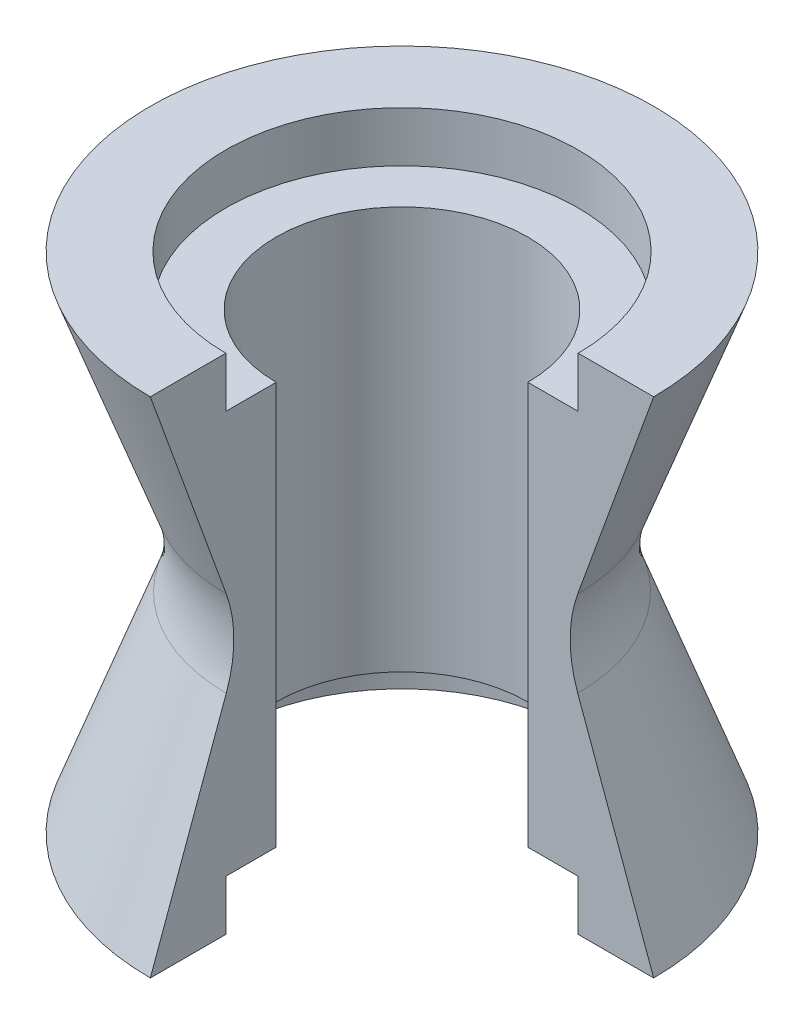
ISO-10303-21;
HEADER;
FILE_DESCRIPTION(('STEP AP214'),'2;1');
FILE_NAME('part.step','',(''),(''),'','','');
FILE_SCHEMA(('AUTOMOTIVE_DESIGN { 1 0 10303 214 1 1 1 1 }'));
ENDSEC;
DATA;
#1=APPLICATION_CONTEXT('core data for automotive mechanical design processes');
#2=APPLICATION_PROTOCOL_DEFINITION('international standard','automotive_design',2000,#1);
#3=PRODUCT_CONTEXT('',#1,'mechanical');
#4=PRODUCT('Part','Part','',(#3));
#5=PRODUCT_RELATED_PRODUCT_CATEGORY('part','',(#4));
#6=PRODUCT_DEFINITION_FORMATION('','',#4);
#7=PRODUCT_DEFINITION_CONTEXT('part definition',#1,'design');
#8=PRODUCT_DEFINITION('design','',#6,#7);
#9=PRODUCT_DEFINITION_SHAPE('','',#8);
#10=(LENGTH_UNIT() NAMED_UNIT(*) SI_UNIT(.MILLI.,.METRE.));
#11=(NAMED_UNIT(*) PLANE_ANGLE_UNIT() SI_UNIT($,.RADIAN.));
#12=(NAMED_UNIT(*) SI_UNIT($,.STERADIAN.) SOLID_ANGLE_UNIT());
#13=UNCERTAINTY_MEASURE_WITH_UNIT(LENGTH_MEASURE(1.E-05),#10,'distance_accuracy_value','');
#14=(GEOMETRIC_REPRESENTATION_CONTEXT(3) GLOBAL_UNCERTAINTY_ASSIGNED_CONTEXT((#13)) GLOBAL_UNIT_ASSIGNED_CONTEXT((#10,
#11,#12)) REPRESENTATION_CONTEXT('',''));
#15=CARTESIAN_POINT('',(0.,0.,0.));
#16=DIRECTION('',(0.,0.,1.));
#17=DIRECTION('',(1.,0.,0.));
#18=AXIS2_PLACEMENT_3D('',#15,#16,#17);
#19=CARTESIAN_POINT('',(0.,0.,0.));
#20=DIRECTION('',(0.,1.,0.));
#21=DIRECTION('',(0.,0.,1.));
#22=AXIS2_PLACEMENT_3D('',#19,#20,#21);
#23=CYLINDRICAL_SURFACE('',#22,25.);
#24=CARTESIAN_POINT('',(0.,90.,0.));
#25=DIRECTION('',(0.,1.,0.));
#26=DIRECTION('',(0.,0.,1.));
#27=AXIS2_PLACEMENT_3D('',#24,#25,#26);
#28=CIRCLE('',#27,25.);
#29=CARTESIAN_POINT('',(0.,90.,25.));
#30=VERTEX_POINT('',#29);
#31=CARTESIAN_POINT('',(25.,90.,0.));
#32=VERTEX_POINT('',#31);
#33=EDGE_CURVE('E138',#30,#32,#28,.F.);
#34=ORIENTED_EDGE('',*,*,#33,.F.);
#35=DIRECTION('',(0.,1.,0.));
#36=VECTOR('',#35,1.);
#37=CARTESIAN_POINT('',(0.,0.,25.));
#38=LINE('',#37,#36);
#39=CARTESIAN_POINT('',(0.,10.,25.));
#40=VERTEX_POINT('',#39);
#41=EDGE_CURVE('E178',#30,#40,#38,.F.);
#42=ORIENTED_EDGE('',*,*,#41,.T.);
#43=CARTESIAN_POINT('',(0.,10.,0.));
#44=DIRECTION('',(0.,-1.,0.));
#45=DIRECTION('',(0.,0.,-1.));
#46=AXIS2_PLACEMENT_3D('',#43,#44,#45);
#47=CIRCLE('',#46,25.);
#48=CARTESIAN_POINT('',(25.,10.,0.));
#49=VERTEX_POINT('',#48);
#50=EDGE_CURVE('E153',#49,#40,#47,.F.);
#51=ORIENTED_EDGE('',*,*,#50,.F.);
#52=DIRECTION('',(0.,1.,0.));
#53=VECTOR('',#52,1.);
#54=CARTESIAN_POINT('',(25.,0.,0.));
#55=LINE('',#54,#53);
#56=EDGE_CURVE('E197',#49,#32,#55,.T.);
#57=ORIENTED_EDGE('',*,*,#56,.T.);
#58=EDGE_LOOP('',(#34,#42,#51,#57));
#59=FACE_BOUND('',#58,.T.);
#60=ADVANCED_FACE('F39',(#59),#23,.F.);
#61=CARTESIAN_POINT('',(0.,0.,0.));
#62=DIRECTION('',(0.,-1.,0.));
#63=DIRECTION('',(0.,0.,1.));
#64=AXIS2_PLACEMENT_3D('',#61,#62,#63);
#65=CONICAL_SURFACE('',#64,50.,0.349065850398867);
#66=CARTESIAN_POINT('',(0.,0.,0.));
#67=DIRECTION('',(0.,1.,0.));
#68=DIRECTION('',(0.,0.,1.));
#69=AXIS2_PLACEMENT_3D('',#66,#67,#68);
#70=CIRCLE('',#69,50.);
#71=CARTESIAN_POINT('',(50.,0.,0.));
#72=VERTEX_POINT('',#71);
#73=CARTESIAN_POINT('',(0.,0.,50.));
#74=VERTEX_POINT('',#73);
#75=EDGE_CURVE('E137',#72,#74,#70,.T.);
#76=ORIENTED_EDGE('',*,*,#75,.T.);
#77=DIRECTION('',(0.,0.939692620785908,-0.342020143325669));
#78=VECTOR('',#77,1.);
#79=CARTESIAN_POINT('',(0.,137.373870972731,0.));
#80=LINE('',#79,#78);
#81=CARTESIAN_POINT('',(0.,41.4494964168583,34.9136170789399));
#82=VERTEX_POINT('',#81);
#83=EDGE_CURVE('E123',#74,#82,#80,.T.);
#84=ORIENTED_EDGE('',*,*,#83,.T.);
#85=CARTESIAN_POINT('',(0.,41.4494964168583,0.));
#86=DIRECTION('',(0.,1.,0.));
#87=DIRECTION('',(0.,0.,1.));
#88=AXIS2_PLACEMENT_3D('',#85,#86,#87);
#89=CIRCLE('',#88,34.9136170789399);
#90=CARTESIAN_POINT('',(34.9136170789399,41.4494964168583,0.));
#91=VERTEX_POINT('',#90);
#92=EDGE_CURVE('E158',#82,#91,#89,.F.);
#93=ORIENTED_EDGE('',*,*,#92,.T.);
#94=DIRECTION('',(0.342020143325669,-0.939692620785908,0.));
#95=VECTOR('',#94,1.);
#96=CARTESIAN_POINT('',(0.,137.373870972731,0.));
#97=LINE('',#96,#95);
#98=EDGE_CURVE('E63',#91,#72,#97,.T.);
#99=ORIENTED_EDGE('',*,*,#98,.T.);
#100=EDGE_LOOP('',(#76,#84,#93,#99));
#101=FACE_BOUND('',#100,.T.);
#102=ADVANCED_FACE('F166',(#101),#65,.T.);
#103=CARTESIAN_POINT('',(0.,0.,0.));
#104=DIRECTION('',(0.,1.,0.));
#105=DIRECTION('',(0.,0.,1.));
#106=AXIS2_PLACEMENT_3D('',#103,#104,#105);
#107=PLANE('',#106);
#108=CARTESIAN_POINT('',(0.,0.,0.));
#109=DIRECTION('',(0.,-1.,0.));
#110=DIRECTION('',(0.,0.,-1.));
#111=AXIS2_PLACEMENT_3D('',#108,#109,#110);
#112=CIRCLE('',#111,35.);
#113=CARTESIAN_POINT('',(0.,0.,35.));
#114=VERTEX_POINT('',#113);
#115=CARTESIAN_POINT('',(35.,0.,0.));
#116=VERTEX_POINT('',#115);
#117=EDGE_CURVE('E186',#114,#116,#112,.T.);
#118=ORIENTED_EDGE('',*,*,#117,.F.);
#119=DIRECTION('',(0.,0.,1.));
#120=VECTOR('',#119,1.);
#121=CARTESIAN_POINT('',(0.,0.,50.));
#122=LINE('',#121,#120);
#123=EDGE_CURVE('E243',#114,#74,#122,.T.);
#124=ORIENTED_EDGE('',*,*,#123,.T.);
#125=ORIENTED_EDGE('',*,*,#75,.F.);
#126=DIRECTION('',(-1.,0.,0.));
#127=VECTOR('',#126,1.);
#128=CARTESIAN_POINT('',(0.,0.,0.));
#129=LINE('',#128,#127);
#130=EDGE_CURVE('E244',#72,#116,#129,.T.);
#131=ORIENTED_EDGE('',*,*,#130,.T.);
#132=EDGE_LOOP('',(#118,#124,#125,#131));
#133=FACE_BOUND('',#132,.T.);
#134=ADVANCED_FACE('F235',(#133),#107,.F.);
#135=CARTESIAN_POINT('',(0.,100.,0.));
#136=DIRECTION('',(0.,1.,0.));
#137=DIRECTION('',(0.,0.,1.));
#138=AXIS2_PLACEMENT_3D('',#135,#136,#137);
#139=CONICAL_SURFACE('',#138,50.,0.349065850398867);
#140=DIRECTION('',(0.,0.939692620785908,0.342020143325669));
#141=VECTOR('',#140,1.);
#142=CARTESIAN_POINT('',(0.,-37.3738709727308,0.));
#143=LINE('',#142,#141);
#144=CARTESIAN_POINT('',(0.,100.000006,50.));
#145=VERTEX_POINT('',#144);
#146=CARTESIAN_POINT('',(0.,58.5505035831417,34.9136170789399));
#147=VERTEX_POINT('',#146);
#148=EDGE_CURVE('E56',#145,#147,#143,.F.);
#149=ORIENTED_EDGE('',*,*,#148,.F.);
#150=CARTESIAN_POINT('',(0.,100.,0.));
#151=DIRECTION('',(0.,1.,0.));
#152=DIRECTION('',(0.,0.,1.));
#153=AXIS2_PLACEMENT_3D('',#150,#151,#152);
#154=CIRCLE('',#153,50.);
#155=CARTESIAN_POINT('',(50.,100.,0.));
#156=VERTEX_POINT('',#155);
#157=EDGE_CURVE('E43',#156,#145,#154,.T.);
#158=ORIENTED_EDGE('',*,*,#157,.F.);
#159=DIRECTION('',(-0.342020143325669,-0.939692620785908,0.));
#160=VECTOR('',#159,1.);
#161=CARTESIAN_POINT('',(0.,-37.3738709727308,0.));
#162=LINE('',#161,#160);
#163=CARTESIAN_POINT('',(34.9136170789399,58.5505035831417,0.));
#164=VERTEX_POINT('',#163);
#165=EDGE_CURVE('E246',#164,#156,#162,.F.);
#166=ORIENTED_EDGE('',*,*,#165,.F.);
#167=CARTESIAN_POINT('',(0.,58.5505035831417,0.));
#168=DIRECTION('',(0.,-1.,0.));
#169=DIRECTION('',(0.,0.,-1.));
#170=AXIS2_PLACEMENT_3D('',#167,#168,#169);
#171=CIRCLE('',#170,34.9136170789399);
#172=EDGE_CURVE('E131',#164,#147,#171,.F.);
#173=ORIENTED_EDGE('',*,*,#172,.T.);
#174=EDGE_LOOP('',(#149,#158,#166,#173));
#175=FACE_BOUND('',#174,.T.);
#176=ADVANCED_FACE('F128',(#175),#139,.T.);
#177=CARTESIAN_POINT('',(0.,100.,0.));
#178=DIRECTION('',(0.,-1.,0.));
#179=DIRECTION('',(0.,0.,1.));
#180=AXIS2_PLACEMENT_3D('',#177,#178,#179);
#181=PLANE('',#180);
#182=ORIENTED_EDGE('',*,*,#157,.T.);
#183=DIRECTION('',(0.,0.,-1.));
#184=VECTOR('',#183,1.);
#185=CARTESIAN_POINT('',(0.,100.,0.));
#186=LINE('',#185,#184);
#187=CARTESIAN_POINT('',(0.,100.,35.));
#188=VERTEX_POINT('',#187);
#189=EDGE_CURVE('E115',#145,#188,#186,.T.);
#190=ORIENTED_EDGE('',*,*,#189,.T.);
#191=CARTESIAN_POINT('',(0.,100.,0.));
#192=DIRECTION('',(0.,1.,0.));
#193=DIRECTION('',(0.,0.,1.));
#194=AXIS2_PLACEMENT_3D('',#191,#192,#193);
#195=CIRCLE('',#194,35.);
#196=CARTESIAN_POINT('',(35.,100.,0.));
#197=VERTEX_POINT('',#196);
#198=EDGE_CURVE('E149',#197,#188,#195,.T.);
#199=ORIENTED_EDGE('',*,*,#198,.F.);
#200=DIRECTION('',(1.,0.,0.));
#201=VECTOR('',#200,1.);
#202=CARTESIAN_POINT('',(0.,100.,0.));
#203=LINE('',#202,#201);
#204=EDGE_CURVE('E136',#197,#156,#203,.T.);
#205=ORIENTED_EDGE('',*,*,#204,.T.);
#206=EDGE_LOOP('',(#182,#190,#199,#205));
#207=FACE_BOUND('',#206,.T.);
#208=ADVANCED_FACE('F135',(#207),#181,.F.);
#209=CARTESIAN_POINT('',(0.,90.,0.));
#210=DIRECTION('',(0.,1.,0.));
#211=DIRECTION('',(0.,0.,1.));
#212=AXIS2_PLACEMENT_3D('',#209,#210,#211);
#213=PLANE('',#212);
#214=DIRECTION('',(0.,0.,1.));
#215=VECTOR('',#214,1.);
#216=CARTESIAN_POINT('',(0.,90.,0.));
#217=LINE('',#216,#215);
#218=CARTESIAN_POINT('',(0.,90.,35.));
#219=VERTEX_POINT('',#218);
#220=EDGE_CURVE('E176',#30,#219,#217,.T.);
#221=ORIENTED_EDGE('',*,*,#220,.F.);
#222=ORIENTED_EDGE('',*,*,#33,.T.);
#223=DIRECTION('',(-1.,0.,0.));
#224=VECTOR('',#223,1.);
#225=CARTESIAN_POINT('',(0.,90.,0.));
#226=LINE('',#225,#224);
#227=CARTESIAN_POINT('',(35.,90.,0.));
#228=VERTEX_POINT('',#227);
#229=EDGE_CURVE('E195',#228,#32,#226,.T.);
#230=ORIENTED_EDGE('',*,*,#229,.F.);
#231=CARTESIAN_POINT('',(0.,90.,0.));
#232=DIRECTION('',(0.,1.,0.));
#233=DIRECTION('',(0.,0.,1.));
#234=AXIS2_PLACEMENT_3D('',#231,#232,#233);
#235=CIRCLE('',#234,35.);
#236=EDGE_CURVE('E142',#228,#219,#235,.T.);
#237=ORIENTED_EDGE('',*,*,#236,.T.);
#238=EDGE_LOOP('',(#221,#222,#230,#237));
#239=FACE_BOUND('',#238,.T.);
#240=ADVANCED_FACE('F220',(#239),#213,.T.);
#241=CARTESIAN_POINT('',(0.,90.,0.));
#242=DIRECTION('',(0.,1.,0.));
#243=DIRECTION('',(0.,0.,1.));
#244=AXIS2_PLACEMENT_3D('',#241,#242,#243);
#245=CYLINDRICAL_SURFACE('',#244,35.);
#246=ORIENTED_EDGE('',*,*,#198,.T.);
#247=DIRECTION('',(0.,1.,0.));
#248=VECTOR('',#247,1.);
#249=CARTESIAN_POINT('',(0.,90.,35.));
#250=LINE('',#249,#248);
#251=EDGE_CURVE('E118',#188,#219,#250,.F.);
#252=ORIENTED_EDGE('',*,*,#251,.T.);
#253=ORIENTED_EDGE('',*,*,#236,.F.);
#254=DIRECTION('',(0.,1.,0.));
#255=VECTOR('',#254,1.);
#256=CARTESIAN_POINT('',(35.,90.,0.));
#257=LINE('',#256,#255);
#258=EDGE_CURVE('E194',#228,#197,#257,.T.);
#259=ORIENTED_EDGE('',*,*,#258,.T.);
#260=EDGE_LOOP('',(#246,#252,#253,#259));
#261=FACE_BOUND('',#260,.T.);
#262=ADVANCED_FACE('F192',(#261),#245,.F.);
#263=CARTESIAN_POINT('',(0.,10.,0.));
#264=DIRECTION('',(0.,-1.,0.));
#265=DIRECTION('',(0.,0.,-1.));
#266=AXIS2_PLACEMENT_3D('',#263,#264,#265);
#267=PLANE('',#266);
#268=DIRECTION('',(0.,0.,-1.));
#269=VECTOR('',#268,1.);
#270=CARTESIAN_POINT('',(0.,10.,0.));
#271=LINE('',#270,#269);
#272=CARTESIAN_POINT('',(0.,10.,35.));
#273=VERTEX_POINT('',#272);
#274=EDGE_CURVE('E181',#273,#40,#271,.T.);
#275=ORIENTED_EDGE('',*,*,#274,.F.);
#276=CARTESIAN_POINT('',(0.,10.,0.));
#277=DIRECTION('',(0.,-1.,0.));
#278=DIRECTION('',(0.,0.,-1.));
#279=AXIS2_PLACEMENT_3D('',#276,#277,#278);
#280=CIRCLE('',#279,35.);
#281=CARTESIAN_POINT('',(35.,10.,0.));
#282=VERTEX_POINT('',#281);
#283=EDGE_CURVE('E156',#273,#282,#280,.T.);
#284=ORIENTED_EDGE('',*,*,#283,.T.);
#285=DIRECTION('',(1.,0.,0.));
#286=VECTOR('',#285,1.);
#287=CARTESIAN_POINT('',(0.,10.,0.));
#288=LINE('',#287,#286);
#289=EDGE_CURVE('E205',#49,#282,#288,.T.);
#290=ORIENTED_EDGE('',*,*,#289,.F.);
#291=ORIENTED_EDGE('',*,*,#50,.T.);
#292=EDGE_LOOP('',(#275,#284,#290,#291));
#293=FACE_BOUND('',#292,.T.);
#294=ADVANCED_FACE('F216',(#293),#267,.T.);
#295=CARTESIAN_POINT('',(0.,10.,0.));
#296=DIRECTION('',(0.,-1.,0.));
#297=DIRECTION('',(0.,0.,-1.));
#298=AXIS2_PLACEMENT_3D('',#295,#296,#297);
#299=CYLINDRICAL_SURFACE('',#298,35.);
#300=ORIENTED_EDGE('',*,*,#283,.F.);
#301=DIRECTION('',(0.,-1.,0.));
#302=VECTOR('',#301,1.);
#303=CARTESIAN_POINT('',(0.,10.,35.));
#304=LINE('',#303,#302);
#305=EDGE_CURVE('E183',#273,#114,#304,.T.);
#306=ORIENTED_EDGE('',*,*,#305,.T.);
#307=ORIENTED_EDGE('',*,*,#117,.T.);
#308=DIRECTION('',(0.,-1.,0.));
#309=VECTOR('',#308,1.);
#310=CARTESIAN_POINT('',(35.,10.,0.));
#311=LINE('',#310,#309);
#312=EDGE_CURVE('E132',#116,#282,#311,.F.);
#313=ORIENTED_EDGE('',*,*,#312,.T.);
#314=EDGE_LOOP('',(#300,#306,#307,#313));
#315=FACE_BOUND('',#314,.T.);
#316=ADVANCED_FACE('F210',(#315),#299,.F.);
#317=CARTESIAN_POINT('',(0.,50.,0.));
#318=DIRECTION('',(0.,1.,0.));
#319=DIRECTION('',(0.,0.,1.));
#320=AXIS2_PLACEMENT_3D('',#317,#318,#319);
#321=TOROIDAL_SURFACE('',#320,58.4059325985876,25.);
#322=ORIENTED_EDGE('',*,*,#92,.F.);
#323=CARTESIAN_POINT('',(0.,50.,58.4059325985876));
#324=DIRECTION('',(-1.,0.,0.));
#325=DIRECTION('',(0.,0.,1.));
#326=AXIS2_PLACEMENT_3D('',#323,#324,#325);
#327=CIRCLE('',#326,25.);
#328=EDGE_CURVE('E11',#82,#147,#327,.F.);
#329=ORIENTED_EDGE('',*,*,#328,.T.);
#330=ORIENTED_EDGE('',*,*,#172,.F.);
#331=CARTESIAN_POINT('',(58.4059325985876,50.,0.));
#332=DIRECTION('',(0.,0.,-1.));
#333=DIRECTION('',(-1.,0.,0.));
#334=AXIS2_PLACEMENT_3D('',#331,#332,#333);
#335=CIRCLE('',#334,25.);
#336=EDGE_CURVE('E48',#164,#91,#335,.F.);
#337=ORIENTED_EDGE('',*,*,#336,.T.);
#338=EDGE_LOOP('',(#322,#329,#330,#337));
#339=FACE_BOUND('',#338,.T.);
#340=ADVANCED_FACE('F41',(#339),#321,.F.);
#341=CARTESIAN_POINT('',(0.,0.,0.));
#342=DIRECTION('',(0.,0.,-1.));
#343=DIRECTION('',(-1.,0.,0.));
#344=AXIS2_PLACEMENT_3D('',#341,#342,#343);
#345=PLANE('',#344);
#346=ORIENTED_EDGE('',*,*,#130,.F.);
#347=ORIENTED_EDGE('',*,*,#98,.F.);
#348=ORIENTED_EDGE('',*,*,#336,.F.);
#349=ORIENTED_EDGE('',*,*,#165,.T.);
#350=ORIENTED_EDGE('',*,*,#204,.F.);
#351=ORIENTED_EDGE('',*,*,#258,.F.);
#352=ORIENTED_EDGE('',*,*,#229,.T.);
#353=ORIENTED_EDGE('',*,*,#56,.F.);
#354=ORIENTED_EDGE('',*,*,#289,.T.);
#355=ORIENTED_EDGE('',*,*,#312,.F.);
#356=EDGE_LOOP('',(#346,#347,#348,#349,#350,#351,#352,#353,#354,#355));
#357=FACE_BOUND('',#356,.T.);
#358=ADVANCED_FACE('F219',(#357),#345,.F.);
#359=CARTESIAN_POINT('',(0.,0.,50.));
#360=DIRECTION('',(-1.,0.,0.));
#361=DIRECTION('',(0.,0.,1.));
#362=AXIS2_PLACEMENT_3D('',#359,#360,#361);
#363=PLANE('',#362);
#364=ORIENTED_EDGE('',*,*,#274,.T.);
#365=ORIENTED_EDGE('',*,*,#41,.F.);
#366=ORIENTED_EDGE('',*,*,#220,.T.);
#367=ORIENTED_EDGE('',*,*,#251,.F.);
#368=ORIENTED_EDGE('',*,*,#189,.F.);
#369=ORIENTED_EDGE('',*,*,#148,.T.);
#370=ORIENTED_EDGE('',*,*,#328,.F.);
#371=ORIENTED_EDGE('',*,*,#83,.F.);
#372=ORIENTED_EDGE('',*,*,#123,.F.);
#373=ORIENTED_EDGE('',*,*,#305,.F.);
#374=EDGE_LOOP('',(#364,#365,#366,#367,#368,#369,#370,#371,#372,#373));
#375=FACE_BOUND('',#374,.T.);
#376=ADVANCED_FACE('F116',(#375),#363,.F.);
#377=CLOSED_SHELL('',(#60,#102,#134,#176,#208,#240,#262,#294,#316,#340,#358,#376));
#378=MANIFOLD_SOLID_BREP('B2',#377);
#379=ADVANCED_BREP_SHAPE_REPRESENTATION('',(#18,#378),#14);
#380=SHAPE_DEFINITION_REPRESENTATION(#9,#379);
ENDSEC;
END-ISO-10303-21;
